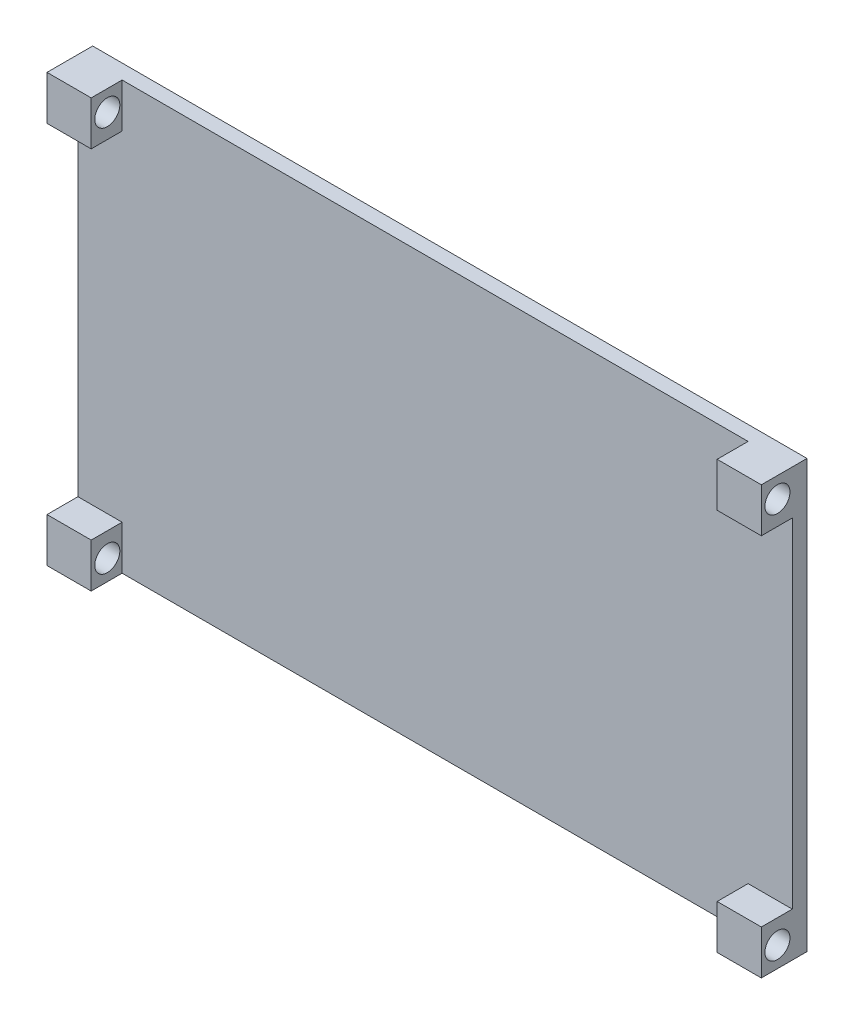
ISO-10303-21;
HEADER;
FILE_DESCRIPTION(('STEP AP214'),'2;1');
FILE_NAME('part.step','',(''),(''),'','','');
FILE_SCHEMA(('AUTOMOTIVE_DESIGN { 1 0 10303 214 1 1 1 1 }'));
ENDSEC;
DATA;
#1=APPLICATION_CONTEXT('core data for automotive mechanical design processes');
#2=APPLICATION_PROTOCOL_DEFINITION('international standard','automotive_design',2000,#1);
#3=PRODUCT_CONTEXT('',#1,'mechanical');
#4=PRODUCT('Part','Part','',(#3));
#5=PRODUCT_RELATED_PRODUCT_CATEGORY('part','',(#4));
#6=PRODUCT_DEFINITION_FORMATION('','',#4);
#7=PRODUCT_DEFINITION_CONTEXT('part definition',#1,'design');
#8=PRODUCT_DEFINITION('design','',#6,#7);
#9=PRODUCT_DEFINITION_SHAPE('','',#8);
#10=(LENGTH_UNIT() NAMED_UNIT(*) SI_UNIT(.MILLI.,.METRE.));
#11=(NAMED_UNIT(*) PLANE_ANGLE_UNIT() SI_UNIT($,.RADIAN.));
#12=(NAMED_UNIT(*) SI_UNIT($,.STERADIAN.) SOLID_ANGLE_UNIT());
#13=UNCERTAINTY_MEASURE_WITH_UNIT(LENGTH_MEASURE(1.E-05),#10,'distance_accuracy_value','');
#14=(GEOMETRIC_REPRESENTATION_CONTEXT(3) GLOBAL_UNCERTAINTY_ASSIGNED_CONTEXT((#13)) GLOBAL_UNIT_ASSIGNED_CONTEXT((#10,
#11,#12)) REPRESENTATION_CONTEXT('',''));
#15=CARTESIAN_POINT('',(0.,0.,0.));
#16=DIRECTION('',(0.,0.,1.));
#17=DIRECTION('',(1.,0.,0.));
#18=AXIS2_PLACEMENT_3D('',#15,#16,#17);
#19=CARTESIAN_POINT('',(0.,0.,0.));
#20=DIRECTION('',(0.,0.,1.));
#21=DIRECTION('',(1.,0.,0.));
#22=AXIS2_PLACEMENT_3D('',#19,#20,#21);
#23=PLANE('',#22);
#24=DIRECTION('',(1.,0.,0.));
#25=VECTOR('',#24,1.);
#26=CARTESIAN_POINT('',(48.5,23.,0.));
#27=LINE('',#26,#25);
#28=CARTESIAN_POINT('',(42.5,23.,0.));
#29=VERTEX_POINT('',#28);
#30=CARTESIAN_POINT('',(48.5,23.,0.));
#31=VERTEX_POINT('',#30);
#32=EDGE_CURVE('E57',#29,#31,#27,.T.);
#33=ORIENTED_EDGE('',*,*,#32,.F.);
#34=DIRECTION('',(0.,-1.,0.));
#35=VECTOR('',#34,1.);
#36=CARTESIAN_POINT('',(42.5,29.,0.));
#37=LINE('',#36,#35);
#38=CARTESIAN_POINT('',(42.5,29.,0.));
#39=VERTEX_POINT('',#38);
#40=EDGE_CURVE('E184',#39,#29,#37,.T.);
#41=ORIENTED_EDGE('',*,*,#40,.F.);
#42=DIRECTION('',(-1.,0.,0.));
#43=VECTOR('',#42,1.);
#44=CARTESIAN_POINT('',(-48.5,29.,0.));
#45=LINE('',#44,#43);
#46=CARTESIAN_POINT('',(-42.5,29.,0.));
#47=VERTEX_POINT('',#46);
#48=EDGE_CURVE('E317',#39,#47,#45,.T.);
#49=ORIENTED_EDGE('',*,*,#48,.T.);
#50=DIRECTION('',(0.,1.,0.));
#51=VECTOR('',#50,1.);
#52=CARTESIAN_POINT('',(-42.5,29.,0.));
#53=LINE('',#52,#51);
#54=CARTESIAN_POINT('',(-42.5,23.,0.));
#55=VERTEX_POINT('',#54);
#56=EDGE_CURVE('E274',#55,#47,#53,.T.);
#57=ORIENTED_EDGE('',*,*,#56,.F.);
#58=DIRECTION('',(1.,0.,0.));
#59=VECTOR('',#58,1.);
#60=CARTESIAN_POINT('',(-48.5,23.,0.));
#61=LINE('',#60,#59);
#62=CARTESIAN_POINT('',(-48.5,23.,0.));
#63=VERTEX_POINT('',#62);
#64=EDGE_CURVE('E268',#63,#55,#61,.T.);
#65=ORIENTED_EDGE('',*,*,#64,.F.);
#66=DIRECTION('',(0.,-1.,0.));
#67=VECTOR('',#66,1.);
#68=CARTESIAN_POINT('',(-48.5,29.,0.));
#69=LINE('',#68,#67);
#70=CARTESIAN_POINT('',(-48.5,-23.,0.));
#71=VERTEX_POINT('',#70);
#72=EDGE_CURVE('E320',#63,#71,#69,.T.);
#73=ORIENTED_EDGE('',*,*,#72,.T.);
#74=DIRECTION('',(-1.,0.,0.));
#75=VECTOR('',#74,1.);
#76=CARTESIAN_POINT('',(-48.5,-23.,0.));
#77=LINE('',#76,#75);
#78=CARTESIAN_POINT('',(-42.5,-23.,0.));
#79=VERTEX_POINT('',#78);
#80=EDGE_CURVE('E244',#79,#71,#77,.T.);
#81=ORIENTED_EDGE('',*,*,#80,.F.);
#82=DIRECTION('',(0.,1.,0.));
#83=VECTOR('',#82,1.);
#84=CARTESIAN_POINT('',(-42.5,-29.,0.));
#85=LINE('',#84,#83);
#86=CARTESIAN_POINT('',(-42.5,-29.,0.));
#87=VERTEX_POINT('',#86);
#88=EDGE_CURVE('E238',#87,#79,#85,.T.);
#89=ORIENTED_EDGE('',*,*,#88,.F.);
#90=DIRECTION('',(1.,0.,0.));
#91=VECTOR('',#90,1.);
#92=CARTESIAN_POINT('',(-48.5,-29.,0.));
#93=LINE('',#92,#91);
#94=CARTESIAN_POINT('',(42.4999999999999,-29.,0.));
#95=VERTEX_POINT('',#94);
#96=EDGE_CURVE('E305',#87,#95,#93,.T.);
#97=ORIENTED_EDGE('',*,*,#96,.T.);
#98=DIRECTION('',(0.,-1.,0.));
#99=VECTOR('',#98,1.);
#100=CARTESIAN_POINT('',(42.5,-29.,0.));
#101=LINE('',#100,#99);
#102=CARTESIAN_POINT('',(42.5,-23.,0.));
#103=VERTEX_POINT('',#102);
#104=EDGE_CURVE('E211',#103,#95,#101,.T.);
#105=ORIENTED_EDGE('',*,*,#104,.F.);
#106=DIRECTION('',(-1.,0.,0.));
#107=VECTOR('',#106,1.);
#108=CARTESIAN_POINT('',(48.5,-23.,0.));
#109=LINE('',#108,#107);
#110=CARTESIAN_POINT('',(48.5,-23.,0.));
#111=VERTEX_POINT('',#110);
#112=EDGE_CURVE('E205',#111,#103,#109,.T.);
#113=ORIENTED_EDGE('',*,*,#112,.F.);
#114=DIRECTION('',(0.,1.,0.));
#115=VECTOR('',#114,1.);
#116=CARTESIAN_POINT('',(48.5,29.,0.));
#117=LINE('',#116,#115);
#118=EDGE_CURVE('E62',#111,#31,#117,.T.);
#119=ORIENTED_EDGE('',*,*,#118,.T.);
#120=EDGE_LOOP('',(#33,#41,#49,#57,#65,#73,#81,#89,#97,#105,#113,#119));
#121=FACE_BOUND('',#120,.T.);
#122=ADVANCED_FACE('F39',(#121),#23,.T.);
#123=CARTESIAN_POINT('',(48.5,29.,-2.));
#124=DIRECTION('',(1.,0.,0.));
#125=DIRECTION('',(0.,1.,0.));
#126=AXIS2_PLACEMENT_3D('',#123,#124,#125);
#127=PLANE('',#126);
#128=CARTESIAN_POINT('',(48.5,26.225,2.01153592672852));
#129=DIRECTION('',(-1.,0.,0.));
#130=DIRECTION('',(0.,-1.,0.));
#131=AXIS2_PLACEMENT_3D('',#128,#129,#130);
#132=CIRCLE('',#131,1.7);
#133=CARTESIAN_POINT('',(48.5,24.525,2.01153592672852));
#134=VERTEX_POINT('',#133);
#135=EDGE_CURVE('E333',#134,#134,#132,.T.);
#136=ORIENTED_EDGE('',*,*,#135,.T.);
#137=EDGE_LOOP('',(#136));
#138=FACE_BOUND('',#137,.T.);
#139=CARTESIAN_POINT('',(48.5,-26.225,2.01153592672852));
#140=DIRECTION('',(-1.,0.,0.));
#141=DIRECTION('',(0.,1.,0.));
#142=AXIS2_PLACEMENT_3D('',#139,#140,#141);
#143=CIRCLE('',#142,1.7);
#144=CARTESIAN_POINT('',(48.5,-27.925,2.01153592672852));
#145=VERTEX_POINT('',#144);
#146=EDGE_CURVE('E346',#145,#145,#143,.T.);
#147=ORIENTED_EDGE('',*,*,#146,.T.);
#148=EDGE_LOOP('',(#147));
#149=FACE_BOUND('',#148,.T.);
#150=ORIENTED_EDGE('',*,*,#118,.F.);
#151=DIRECTION('',(0.,0.,-1.));
#152=VECTOR('',#151,1.);
#153=CARTESIAN_POINT('',(48.5,-23.,4.2));
#154=LINE('',#153,#152);
#155=CARTESIAN_POINT('',(48.5,-23.,4.2));
#156=VERTEX_POINT('',#155);
#157=EDGE_CURVE('E234',#156,#111,#154,.T.);
#158=ORIENTED_EDGE('',*,*,#157,.F.);
#159=DIRECTION('',(0.,1.,0.));
#160=VECTOR('',#159,1.);
#161=CARTESIAN_POINT('',(48.5,-29.,4.2));
#162=LINE('',#161,#160);
#163=CARTESIAN_POINT('',(48.5,-29.,4.2));
#164=VERTEX_POINT('',#163);
#165=EDGE_CURVE('E210',#164,#156,#162,.T.);
#166=ORIENTED_EDGE('',*,*,#165,.F.);
#167=DIRECTION('',(0.,0.,1.));
#168=VECTOR('',#167,1.);
#169=CARTESIAN_POINT('',(48.5,-29.,-2.));
#170=LINE('',#169,#168);
#171=CARTESIAN_POINT('',(48.5,-29.,-2.));
#172=VERTEX_POINT('',#171);
#173=EDGE_CURVE('E11',#172,#164,#170,.T.);
#174=ORIENTED_EDGE('',*,*,#173,.F.);
#175=DIRECTION('',(0.,1.,0.));
#176=VECTOR('',#175,1.);
#177=CARTESIAN_POINT('',(48.5,29.,-2.));
#178=LINE('',#177,#176);
#179=CARTESIAN_POINT('',(48.5,29.,-2.));
#180=VERTEX_POINT('',#179);
#181=EDGE_CURVE('E159',#172,#180,#178,.T.);
#182=ORIENTED_EDGE('',*,*,#181,.T.);
#183=DIRECTION('',(0.,0.,1.));
#184=VECTOR('',#183,1.);
#185=CARTESIAN_POINT('',(48.5,29.,-2.));
#186=LINE('',#185,#184);
#187=CARTESIAN_POINT('',(48.5,29.,4.2));
#188=VERTEX_POINT('',#187);
#189=EDGE_CURVE('E153',#180,#188,#186,.T.);
#190=ORIENTED_EDGE('',*,*,#189,.T.);
#191=DIRECTION('',(0.,1.,0.));
#192=VECTOR('',#191,1.);
#193=CARTESIAN_POINT('',(48.5,29.,4.2));
#194=LINE('',#193,#192);
#195=CARTESIAN_POINT('',(48.5,23.,4.2));
#196=VERTEX_POINT('',#195);
#197=EDGE_CURVE('E157',#196,#188,#194,.T.);
#198=ORIENTED_EDGE('',*,*,#197,.F.);
#199=DIRECTION('',(0.,0.,-1.));
#200=VECTOR('',#199,1.);
#201=CARTESIAN_POINT('',(48.5,23.,4.2));
#202=LINE('',#201,#200);
#203=EDGE_CURVE('E194',#196,#31,#202,.T.);
#204=ORIENTED_EDGE('',*,*,#203,.T.);
#205=EDGE_LOOP('',(#150,#158,#166,#174,#182,#190,#198,#204));
#206=FACE_BOUND('',#205,.T.);
#207=ADVANCED_FACE('F41',(#138,#149,#206),#127,.T.);
#208=CARTESIAN_POINT('',(-48.5,-29.,-2.));
#209=DIRECTION('',(0.,-1.,0.));
#210=DIRECTION('',(0.,0.,-1.));
#211=AXIS2_PLACEMENT_3D('',#208,#209,#210);
#212=PLANE('',#211);
#213=ORIENTED_EDGE('',*,*,#96,.F.);
#214=DIRECTION('',(0.,0.,-1.));
#215=VECTOR('',#214,1.);
#216=CARTESIAN_POINT('',(-42.5,-29.,4.2));
#217=LINE('',#216,#215);
#218=CARTESIAN_POINT('',(-42.5,-29.,4.2));
#219=VERTEX_POINT('',#218);
#220=EDGE_CURVE('E265',#219,#87,#217,.T.);
#221=ORIENTED_EDGE('',*,*,#220,.F.);
#222=DIRECTION('',(1.,0.,0.));
#223=VECTOR('',#222,1.);
#224=CARTESIAN_POINT('',(-48.5,-29.,4.2));
#225=LINE('',#224,#223);
#226=CARTESIAN_POINT('',(-48.5,-29.,4.2));
#227=VERTEX_POINT('',#226);
#228=EDGE_CURVE('E243',#227,#219,#225,.T.);
#229=ORIENTED_EDGE('',*,*,#228,.F.);
#230=DIRECTION('',(0.,0.,1.));
#231=VECTOR('',#230,1.);
#232=CARTESIAN_POINT('',(-48.5,-29.,-2.));
#233=LINE('',#232,#231);
#234=CARTESIAN_POINT('',(-48.5,-29.,-2.));
#235=VERTEX_POINT('',#234);
#236=EDGE_CURVE('E49',#235,#227,#233,.T.);
#237=ORIENTED_EDGE('',*,*,#236,.F.);
#238=DIRECTION('',(1.,0.,0.));
#239=VECTOR('',#238,1.);
#240=CARTESIAN_POINT('',(-48.5,-29.,-2.));
#241=LINE('',#240,#239);
#242=EDGE_CURVE('E165',#235,#172,#241,.T.);
#243=ORIENTED_EDGE('',*,*,#242,.T.);
#244=ORIENTED_EDGE('',*,*,#173,.T.);
#245=DIRECTION('',(1.,0.,0.));
#246=VECTOR('',#245,1.);
#247=CARTESIAN_POINT('',(48.5,-29.,4.2));
#248=LINE('',#247,#246);
#249=CARTESIAN_POINT('',(42.5,-29.,4.2));
#250=VERTEX_POINT('',#249);
#251=EDGE_CURVE('E206',#250,#164,#248,.T.);
#252=ORIENTED_EDGE('',*,*,#251,.F.);
#253=DIRECTION('',(0.,0.,-1.));
#254=VECTOR('',#253,1.);
#255=CARTESIAN_POINT('',(42.5,-29.,4.2));
#256=LINE('',#255,#254);
#257=EDGE_CURVE('E220',#250,#95,#256,.T.);
#258=ORIENTED_EDGE('',*,*,#257,.T.);
#259=EDGE_LOOP('',(#213,#221,#229,#237,#243,#244,#252,#258));
#260=FACE_BOUND('',#259,.T.);
#261=ADVANCED_FACE('F363',(#260),#212,.T.);
#262=CARTESIAN_POINT('',(-48.5,29.,-2.));
#263=DIRECTION('',(-1.,0.,0.));
#264=DIRECTION('',(0.,-1.,0.));
#265=AXIS2_PLACEMENT_3D('',#262,#263,#264);
#266=PLANE('',#265);
#267=CARTESIAN_POINT('',(-48.5,26.225,2.01153592672852));
#268=DIRECTION('',(-1.,0.,0.));
#269=DIRECTION('',(0.,-1.,0.));
#270=AXIS2_PLACEMENT_3D('',#267,#268,#269);
#271=CIRCLE('',#270,1.7);
#272=CARTESIAN_POINT('',(-48.5,24.525,2.01153592672852));
#273=VERTEX_POINT('',#272);
#274=EDGE_CURVE('E340',#273,#273,#271,.T.);
#275=ORIENTED_EDGE('',*,*,#274,.F.);
#276=EDGE_LOOP('',(#275));
#277=FACE_BOUND('',#276,.T.);
#278=CARTESIAN_POINT('',(-48.5,-26.225,2.01153592672852));
#279=DIRECTION('',(-1.,0.,0.));
#280=DIRECTION('',(0.,1.,0.));
#281=AXIS2_PLACEMENT_3D('',#278,#279,#280);
#282=CIRCLE('',#281,1.7);
#283=CARTESIAN_POINT('',(-48.5,-27.925,2.01153592672852));
#284=VERTEX_POINT('',#283);
#285=EDGE_CURVE('E352',#284,#284,#282,.T.);
#286=ORIENTED_EDGE('',*,*,#285,.F.);
#287=EDGE_LOOP('',(#286));
#288=FACE_BOUND('',#287,.T.);
#289=ORIENTED_EDGE('',*,*,#72,.F.);
#290=DIRECTION('',(0.,0.,-1.));
#291=VECTOR('',#290,1.);
#292=CARTESIAN_POINT('',(-48.5,23.,4.2));
#293=LINE('',#292,#291);
#294=CARTESIAN_POINT('',(-48.5,23.,4.2));
#295=VERTEX_POINT('',#294);
#296=EDGE_CURVE('E298',#295,#63,#293,.T.);
#297=ORIENTED_EDGE('',*,*,#296,.F.);
#298=DIRECTION('',(0.,-1.,0.));
#299=VECTOR('',#298,1.);
#300=CARTESIAN_POINT('',(-48.5,29.,4.2));
#301=LINE('',#300,#299);
#302=CARTESIAN_POINT('',(-48.5,29.,4.2));
#303=VERTEX_POINT('',#302);
#304=EDGE_CURVE('E269',#303,#295,#301,.T.);
#305=ORIENTED_EDGE('',*,*,#304,.F.);
#306=DIRECTION('',(0.,0.,1.));
#307=VECTOR('',#306,1.);
#308=CARTESIAN_POINT('',(-48.5,29.,-2.));
#309=LINE('',#308,#307);
#310=CARTESIAN_POINT('',(-48.5,29.,-2.));
#311=VERTEX_POINT('',#310);
#312=EDGE_CURVE('E164',#311,#303,#309,.T.);
#313=ORIENTED_EDGE('',*,*,#312,.F.);
#314=DIRECTION('',(0.,-1.,0.));
#315=VECTOR('',#314,1.);
#316=CARTESIAN_POINT('',(-48.5,29.,-2.));
#317=LINE('',#316,#315);
#318=EDGE_CURVE('E308',#311,#235,#317,.T.);
#319=ORIENTED_EDGE('',*,*,#318,.T.);
#320=ORIENTED_EDGE('',*,*,#236,.T.);
#321=DIRECTION('',(0.,-1.,0.));
#322=VECTOR('',#321,1.);
#323=CARTESIAN_POINT('',(-48.5,-29.,4.2));
#324=LINE('',#323,#322);
#325=CARTESIAN_POINT('',(-48.5,-23.,4.2));
#326=VERTEX_POINT('',#325);
#327=EDGE_CURVE('E239',#326,#227,#324,.T.);
#328=ORIENTED_EDGE('',*,*,#327,.F.);
#329=DIRECTION('',(0.,0.,-1.));
#330=VECTOR('',#329,1.);
#331=CARTESIAN_POINT('',(-48.5,-23.,4.2));
#332=LINE('',#331,#330);
#333=EDGE_CURVE('E253',#326,#71,#332,.T.);
#334=ORIENTED_EDGE('',*,*,#333,.T.);
#335=EDGE_LOOP('',(#289,#297,#305,#313,#319,#320,#328,#334));
#336=FACE_BOUND('',#335,.T.);
#337=ADVANCED_FACE('F360',(#277,#288,#336),#266,.T.);
#338=CARTESIAN_POINT('',(-48.5,29.,-2.));
#339=DIRECTION('',(0.,1.,0.));
#340=DIRECTION('',(0.,0.,1.));
#341=AXIS2_PLACEMENT_3D('',#338,#339,#340);
#342=PLANE('',#341);
#343=ORIENTED_EDGE('',*,*,#48,.F.);
#344=DIRECTION('',(0.,0.,-1.));
#345=VECTOR('',#344,1.);
#346=CARTESIAN_POINT('',(42.5,29.,4.2));
#347=LINE('',#346,#345);
#348=CARTESIAN_POINT('',(42.5,29.,4.2));
#349=VERTEX_POINT('',#348);
#350=EDGE_CURVE('E171',#349,#39,#347,.T.);
#351=ORIENTED_EDGE('',*,*,#350,.F.);
#352=DIRECTION('',(-1.,0.,0.));
#353=VECTOR('',#352,1.);
#354=CARTESIAN_POINT('',(48.5,29.,4.2));
#355=LINE('',#354,#353);
#356=EDGE_CURVE('E168',#188,#349,#355,.T.);
#357=ORIENTED_EDGE('',*,*,#356,.F.);
#358=ORIENTED_EDGE('',*,*,#189,.F.);
#359=DIRECTION('',(-1.,0.,0.));
#360=VECTOR('',#359,1.);
#361=CARTESIAN_POINT('',(-48.5,29.,-2.));
#362=LINE('',#361,#360);
#363=EDGE_CURVE('E304',#180,#311,#362,.T.);
#364=ORIENTED_EDGE('',*,*,#363,.T.);
#365=ORIENTED_EDGE('',*,*,#312,.T.);
#366=DIRECTION('',(-1.,0.,0.));
#367=VECTOR('',#366,1.);
#368=CARTESIAN_POINT('',(-48.5,29.,4.2));
#369=LINE('',#368,#367);
#370=CARTESIAN_POINT('',(-42.5,29.,4.2));
#371=VERTEX_POINT('',#370);
#372=EDGE_CURVE('E280',#371,#303,#369,.T.);
#373=ORIENTED_EDGE('',*,*,#372,.F.);
#374=DIRECTION('',(0.,0.,-1.));
#375=VECTOR('',#374,1.);
#376=CARTESIAN_POINT('',(-42.5,29.,4.2));
#377=LINE('',#376,#375);
#378=EDGE_CURVE('E284',#371,#47,#377,.T.);
#379=ORIENTED_EDGE('',*,*,#378,.T.);
#380=EDGE_LOOP('',(#343,#351,#357,#358,#364,#365,#373,#379));
#381=FACE_BOUND('',#380,.T.);
#382=ADVANCED_FACE('F169',(#381),#342,.T.);
#383=CARTESIAN_POINT('',(0.,0.,-2.));
#384=DIRECTION('',(0.,0.,1.));
#385=DIRECTION('',(1.,0.,0.));
#386=AXIS2_PLACEMENT_3D('',#383,#384,#385);
#387=PLANE('',#386);
#388=ORIENTED_EDGE('',*,*,#181,.F.);
#389=ORIENTED_EDGE('',*,*,#242,.F.);
#390=ORIENTED_EDGE('',*,*,#318,.F.);
#391=ORIENTED_EDGE('',*,*,#363,.F.);
#392=EDGE_LOOP('',(#388,#389,#390,#391));
#393=FACE_BOUND('',#392,.T.);
#394=ADVANCED_FACE('F382',(#393),#387,.F.);
#395=CARTESIAN_POINT('',(-48.5,23.,4.2));
#396=DIRECTION('',(0.,1.,0.));
#397=DIRECTION('',(0.,0.,1.));
#398=AXIS2_PLACEMENT_3D('',#395,#396,#397);
#399=PLANE('',#398);
#400=ORIENTED_EDGE('',*,*,#64,.T.);
#401=DIRECTION('',(0.,0.,-1.));
#402=VECTOR('',#401,1.);
#403=CARTESIAN_POINT('',(-42.5,23.,4.2));
#404=LINE('',#403,#402);
#405=CARTESIAN_POINT('',(-42.5,23.,4.2));
#406=VERTEX_POINT('',#405);
#407=EDGE_CURVE('E294',#406,#55,#404,.T.);
#408=ORIENTED_EDGE('',*,*,#407,.F.);
#409=DIRECTION('',(1.,0.,0.));
#410=VECTOR('',#409,1.);
#411=CARTESIAN_POINT('',(-48.5,23.,4.2));
#412=LINE('',#411,#410);
#413=EDGE_CURVE('E273',#295,#406,#412,.T.);
#414=ORIENTED_EDGE('',*,*,#413,.F.);
#415=ORIENTED_EDGE('',*,*,#296,.T.);
#416=EDGE_LOOP('',(#400,#408,#414,#415));
#417=FACE_BOUND('',#416,.T.);
#418=ADVANCED_FACE('F373',(#417),#399,.F.);
#419=CARTESIAN_POINT('',(-42.5,29.,4.2));
#420=DIRECTION('',(-1.,0.,0.));
#421=DIRECTION('',(0.,-1.,0.));
#422=AXIS2_PLACEMENT_3D('',#419,#420,#421);
#423=PLANE('',#422);
#424=CARTESIAN_POINT('',(-42.5,26.225,2.01153592672852));
#425=DIRECTION('',(-1.,0.,0.));
#426=DIRECTION('',(0.,-1.,0.));
#427=AXIS2_PLACEMENT_3D('',#424,#425,#426);
#428=CIRCLE('',#427,1.7);
#429=CARTESIAN_POINT('',(-42.5,24.525,2.01153592672852));
#430=VERTEX_POINT('',#429);
#431=EDGE_CURVE('E332',#430,#430,#428,.T.);
#432=ORIENTED_EDGE('',*,*,#431,.T.);
#433=EDGE_LOOP('',(#432));
#434=FACE_BOUND('',#433,.T.);
#435=ORIENTED_EDGE('',*,*,#56,.T.);
#436=ORIENTED_EDGE('',*,*,#378,.F.);
#437=DIRECTION('',(0.,1.,0.));
#438=VECTOR('',#437,1.);
#439=CARTESIAN_POINT('',(-42.5,29.,4.2));
#440=LINE('',#439,#438);
#441=EDGE_CURVE('E277',#406,#371,#440,.T.);
#442=ORIENTED_EDGE('',*,*,#441,.F.);
#443=ORIENTED_EDGE('',*,*,#407,.T.);
#444=EDGE_LOOP('',(#435,#436,#442,#443));
#445=FACE_BOUND('',#444,.T.);
#446=ADVANCED_FACE('F414',(#434,#445),#423,.F.);
#447=CARTESIAN_POINT('',(0.,0.,4.2));
#448=DIRECTION('',(0.,0.,1.));
#449=DIRECTION('',(1.,0.,0.));
#450=AXIS2_PLACEMENT_3D('',#447,#448,#449);
#451=PLANE('',#450);
#452=ORIENTED_EDGE('',*,*,#304,.T.);
#453=ORIENTED_EDGE('',*,*,#413,.T.);
#454=ORIENTED_EDGE('',*,*,#441,.T.);
#455=ORIENTED_EDGE('',*,*,#372,.T.);
#456=EDGE_LOOP('',(#452,#453,#454,#455));
#457=FACE_BOUND('',#456,.T.);
#458=ADVANCED_FACE('F377',(#457),#451,.T.);
#459=CARTESIAN_POINT('',(-42.5,-29.,4.2));
#460=DIRECTION('',(-1.,0.,0.));
#461=DIRECTION('',(0.,-1.,0.));
#462=AXIS2_PLACEMENT_3D('',#459,#460,#461);
#463=PLANE('',#462);
#464=CARTESIAN_POINT('',(-42.5,-26.225,2.01153592672852));
#465=DIRECTION('',(-1.,0.,0.));
#466=DIRECTION('',(0.,-1.,0.));
#467=AXIS2_PLACEMENT_3D('',#464,#465,#466);
#468=CIRCLE('',#467,1.7);
#469=CARTESIAN_POINT('',(-42.5,-27.925,2.01153592672852));
#470=VERTEX_POINT('',#469);
#471=EDGE_CURVE('E187',#470,#470,#468,.T.);
#472=ORIENTED_EDGE('',*,*,#471,.T.);
#473=EDGE_LOOP('',(#472));
#474=FACE_BOUND('',#473,.T.);
#475=ORIENTED_EDGE('',*,*,#88,.T.);
#476=DIRECTION('',(0.,0.,-1.));
#477=VECTOR('',#476,1.);
#478=CARTESIAN_POINT('',(-42.5,-23.,4.2));
#479=LINE('',#478,#477);
#480=CARTESIAN_POINT('',(-42.5,-23.,4.2));
#481=VERTEX_POINT('',#480);
#482=EDGE_CURVE('E262',#481,#79,#479,.T.);
#483=ORIENTED_EDGE('',*,*,#482,.F.);
#484=DIRECTION('',(0.,1.,0.));
#485=VECTOR('',#484,1.);
#486=CARTESIAN_POINT('',(-42.5,-29.,4.2));
#487=LINE('',#486,#485);
#488=EDGE_CURVE('E247',#219,#481,#487,.T.);
#489=ORIENTED_EDGE('',*,*,#488,.F.);
#490=ORIENTED_EDGE('',*,*,#220,.T.);
#491=EDGE_LOOP('',(#475,#483,#489,#490));
#492=FACE_BOUND('',#491,.T.);
#493=ADVANCED_FACE('F422',(#474,#492),#463,.F.);
#494=CARTESIAN_POINT('',(-48.5,-23.,4.2));
#495=DIRECTION('',(0.,-1.,0.));
#496=DIRECTION('',(0.,0.,-1.));
#497=AXIS2_PLACEMENT_3D('',#494,#495,#496);
#498=PLANE('',#497);
#499=ORIENTED_EDGE('',*,*,#80,.T.);
#500=ORIENTED_EDGE('',*,*,#333,.F.);
#501=DIRECTION('',(-1.,0.,0.));
#502=VECTOR('',#501,1.);
#503=CARTESIAN_POINT('',(-48.5,-23.,4.2));
#504=LINE('',#503,#502);
#505=EDGE_CURVE('E250',#481,#326,#504,.T.);
#506=ORIENTED_EDGE('',*,*,#505,.F.);
#507=ORIENTED_EDGE('',*,*,#482,.T.);
#508=EDGE_LOOP('',(#499,#500,#506,#507));
#509=FACE_BOUND('',#508,.T.);
#510=ADVANCED_FACE('F395',(#509),#498,.F.);
#511=CARTESIAN_POINT('',(0.,0.,4.2));
#512=DIRECTION('',(0.,0.,-1.));
#513=DIRECTION('',(-1.,0.,0.));
#514=AXIS2_PLACEMENT_3D('',#511,#512,#513);
#515=PLANE('',#514);
#516=ORIENTED_EDGE('',*,*,#327,.T.);
#517=ORIENTED_EDGE('',*,*,#228,.T.);
#518=ORIENTED_EDGE('',*,*,#488,.T.);
#519=ORIENTED_EDGE('',*,*,#505,.T.);
#520=EDGE_LOOP('',(#516,#517,#518,#519));
#521=FACE_BOUND('',#520,.T.);
#522=ADVANCED_FACE('F390',(#521),#515,.F.);
#523=CARTESIAN_POINT('',(48.5,-23.,4.2));
#524=DIRECTION('',(0.,-1.,0.));
#525=DIRECTION('',(0.,0.,-1.));
#526=AXIS2_PLACEMENT_3D('',#523,#524,#525);
#527=PLANE('',#526);
#528=ORIENTED_EDGE('',*,*,#112,.T.);
#529=DIRECTION('',(0.,0.,-1.));
#530=VECTOR('',#529,1.);
#531=CARTESIAN_POINT('',(42.5,-23.,4.2));
#532=LINE('',#531,#530);
#533=CARTESIAN_POINT('',(42.5,-23.,4.2));
#534=VERTEX_POINT('',#533);
#535=EDGE_CURVE('E230',#534,#103,#532,.T.);
#536=ORIENTED_EDGE('',*,*,#535,.F.);
#537=DIRECTION('',(-1.,0.,0.));
#538=VECTOR('',#537,1.);
#539=CARTESIAN_POINT('',(48.5,-23.,4.2));
#540=LINE('',#539,#538);
#541=EDGE_CURVE('E214',#156,#534,#540,.T.);
#542=ORIENTED_EDGE('',*,*,#541,.F.);
#543=ORIENTED_EDGE('',*,*,#157,.T.);
#544=EDGE_LOOP('',(#528,#536,#542,#543));
#545=FACE_BOUND('',#544,.T.);
#546=ADVANCED_FACE('F404',(#545),#527,.F.);
#547=CARTESIAN_POINT('',(42.5,-29.,4.2));
#548=DIRECTION('',(1.,0.,0.));
#549=DIRECTION('',(0.,1.,0.));
#550=AXIS2_PLACEMENT_3D('',#547,#548,#549);
#551=PLANE('',#550);
#552=CARTESIAN_POINT('',(42.5,-26.225,2.01153592672852));
#553=DIRECTION('',(1.,0.,0.));
#554=DIRECTION('',(0.,1.,0.));
#555=AXIS2_PLACEMENT_3D('',#552,#553,#554);
#556=CIRCLE('',#555,1.7);
#557=CARTESIAN_POINT('',(42.5,-27.925,2.01153592672852));
#558=VERTEX_POINT('',#557);
#559=EDGE_CURVE('E43',#558,#558,#556,.T.);
#560=ORIENTED_EDGE('',*,*,#559,.T.);
#561=EDGE_LOOP('',(#560));
#562=FACE_BOUND('',#561,.T.);
#563=ORIENTED_EDGE('',*,*,#104,.T.);
#564=ORIENTED_EDGE('',*,*,#257,.F.);
#565=DIRECTION('',(0.,-1.,0.));
#566=VECTOR('',#565,1.);
#567=CARTESIAN_POINT('',(42.5,-29.,4.2));
#568=LINE('',#567,#566);
#569=EDGE_CURVE('E217',#534,#250,#568,.T.);
#570=ORIENTED_EDGE('',*,*,#569,.F.);
#571=ORIENTED_EDGE('',*,*,#535,.T.);
#572=EDGE_LOOP('',(#563,#564,#570,#571));
#573=FACE_BOUND('',#572,.T.);
#574=ADVANCED_FACE('F401',(#562,#573),#551,.F.);
#575=CARTESIAN_POINT('',(0.,0.,4.2));
#576=DIRECTION('',(0.,0.,-1.));
#577=DIRECTION('',(-1.,0.,0.));
#578=AXIS2_PLACEMENT_3D('',#575,#576,#577);
#579=PLANE('',#578);
#580=ORIENTED_EDGE('',*,*,#251,.T.);
#581=ORIENTED_EDGE('',*,*,#165,.T.);
#582=ORIENTED_EDGE('',*,*,#541,.T.);
#583=ORIENTED_EDGE('',*,*,#569,.T.);
#584=EDGE_LOOP('',(#580,#581,#582,#583));
#585=FACE_BOUND('',#584,.T.);
#586=ADVANCED_FACE('F486',(#585),#579,.F.);
#587=CARTESIAN_POINT('',(42.5,29.,4.2));
#588=DIRECTION('',(1.,0.,0.));
#589=DIRECTION('',(0.,1.,0.));
#590=AXIS2_PLACEMENT_3D('',#587,#588,#589);
#591=PLANE('',#590);
#592=CARTESIAN_POINT('',(42.5,26.225,2.01153592672852));
#593=DIRECTION('',(1.,0.,0.));
#594=DIRECTION('',(0.,1.,0.));
#595=AXIS2_PLACEMENT_3D('',#592,#593,#594);
#596=CIRCLE('',#595,1.7);
#597=CARTESIAN_POINT('',(42.5,24.525,2.01153592672852));
#598=VERTEX_POINT('',#597);
#599=EDGE_CURVE('E329',#598,#598,#596,.T.);
#600=ORIENTED_EDGE('',*,*,#599,.T.);
#601=EDGE_LOOP('',(#600));
#602=FACE_BOUND('',#601,.T.);
#603=ORIENTED_EDGE('',*,*,#40,.T.);
#604=DIRECTION('',(0.,0.,-1.));
#605=VECTOR('',#604,1.);
#606=CARTESIAN_POINT('',(42.5,23.,4.2));
#607=LINE('',#606,#605);
#608=CARTESIAN_POINT('',(42.5,23.,4.2));
#609=VERTEX_POINT('',#608);
#610=EDGE_CURVE('E199',#609,#29,#607,.T.);
#611=ORIENTED_EDGE('',*,*,#610,.F.);
#612=DIRECTION('',(0.,-1.,0.));
#613=VECTOR('',#612,1.);
#614=CARTESIAN_POINT('',(42.5,29.,4.2));
#615=LINE('',#614,#613);
#616=EDGE_CURVE('E175',#349,#609,#615,.T.);
#617=ORIENTED_EDGE('',*,*,#616,.F.);
#618=ORIENTED_EDGE('',*,*,#350,.T.);
#619=EDGE_LOOP('',(#603,#611,#617,#618));
#620=FACE_BOUND('',#619,.T.);
#621=ADVANCED_FACE('F411',(#602,#620),#591,.F.);
#622=CARTESIAN_POINT('',(48.5,23.,4.2));
#623=DIRECTION('',(0.,1.,0.));
#624=DIRECTION('',(0.,0.,1.));
#625=AXIS2_PLACEMENT_3D('',#622,#623,#624);
#626=PLANE('',#625);
#627=ORIENTED_EDGE('',*,*,#32,.T.);
#628=ORIENTED_EDGE('',*,*,#203,.F.);
#629=DIRECTION('',(1.,0.,0.));
#630=VECTOR('',#629,1.);
#631=CARTESIAN_POINT('',(48.5,23.,4.2));
#632=LINE('',#631,#630);
#633=EDGE_CURVE('E179',#609,#196,#632,.T.);
#634=ORIENTED_EDGE('',*,*,#633,.F.);
#635=ORIENTED_EDGE('',*,*,#610,.T.);
#636=EDGE_LOOP('',(#627,#628,#634,#635));
#637=FACE_BOUND('',#636,.T.);
#638=ADVANCED_FACE('F408',(#637),#626,.F.);
#639=CARTESIAN_POINT('',(0.,0.,4.2));
#640=DIRECTION('',(0.,0.,-1.));
#641=DIRECTION('',(-1.,0.,0.));
#642=AXIS2_PLACEMENT_3D('',#639,#640,#641);
#643=PLANE('',#642);
#644=ORIENTED_EDGE('',*,*,#197,.T.);
#645=ORIENTED_EDGE('',*,*,#356,.T.);
#646=ORIENTED_EDGE('',*,*,#616,.T.);
#647=ORIENTED_EDGE('',*,*,#633,.T.);
#648=EDGE_LOOP('',(#644,#645,#646,#647));
#649=FACE_BOUND('',#648,.T.);
#650=ADVANCED_FACE('F177',(#649),#643,.F.);
#651=CARTESIAN_POINT('',(48.5,26.225,2.01153592672852));
#652=DIRECTION('',(-1.,0.,0.));
#653=DIRECTION('',(0.,-1.,0.));
#654=AXIS2_PLACEMENT_3D('',#651,#652,#653);
#655=CYLINDRICAL_SURFACE('',#654,1.7);
#656=CARTESIAN_POINT('',(48.5,24.525,2.01153592672852));
#657=CARTESIAN_POINT('',(48.4375,24.525,2.01153592672852));
#658=CARTESIAN_POINT('',(48.375,24.525,2.01153592672852));
#659=CARTESIAN_POINT('',(48.25,24.525,2.01153592672852));
#660=CARTESIAN_POINT('',(48.1875,24.525,2.01153592672852));
#661=CARTESIAN_POINT('',(48.0625,24.525,2.01153592672852));
#662=CARTESIAN_POINT('',(48.,24.525,2.01153592672852));
#663=CARTESIAN_POINT('',(47.875,24.525,2.01153592672852));
#664=CARTESIAN_POINT('',(47.8125,24.525,2.01153592672852));
#665=CARTESIAN_POINT('',(47.6875,24.525,2.01153592672852));
#666=CARTESIAN_POINT('',(47.625,24.525,2.01153592672852));
#667=CARTESIAN_POINT('',(47.5,24.525,2.01153592672852));
#668=CARTESIAN_POINT('',(47.4375,24.525,2.01153592672852));
#669=CARTESIAN_POINT('',(47.3125,24.525,2.01153592672852));
#670=CARTESIAN_POINT('',(47.25,24.525,2.01153592672852));
#671=CARTESIAN_POINT('',(47.125,24.525,2.01153592672852));
#672=CARTESIAN_POINT('',(47.0625,24.525,2.01153592672852));
#673=CARTESIAN_POINT('',(46.9375,24.525,2.01153592672852));
#674=CARTESIAN_POINT('',(46.875,24.525,2.01153592672852));
#675=CARTESIAN_POINT('',(46.75,24.525,2.01153592672852));
#676=CARTESIAN_POINT('',(46.6875,24.525,2.01153592672852));
#677=CARTESIAN_POINT('',(46.5625,24.525,2.01153592672852));
#678=CARTESIAN_POINT('',(46.5,24.525,2.01153592672852));
#679=CARTESIAN_POINT('',(46.375,24.525,2.01153592672852));
#680=CARTESIAN_POINT('',(46.3125,24.525,2.01153592672852));
#681=CARTESIAN_POINT('',(46.1875,24.525,2.01153592672852));
#682=CARTESIAN_POINT('',(46.125,24.525,2.01153592672852));
#683=CARTESIAN_POINT('',(46.,24.525,2.01153592672852));
#684=CARTESIAN_POINT('',(45.9375,24.525,2.01153592672852));
#685=CARTESIAN_POINT('',(45.8125,24.525,2.01153592672852));
#686=CARTESIAN_POINT('',(45.75,24.525,2.01153592672852));
#687=CARTESIAN_POINT('',(45.625,24.525,2.01153592672852));
#688=CARTESIAN_POINT('',(45.5625,24.525,2.01153592672852));
#689=CARTESIAN_POINT('',(45.4375,24.525,2.01153592672852));
#690=CARTESIAN_POINT('',(45.375,24.525,2.01153592672852));
#691=CARTESIAN_POINT('',(45.25,24.525,2.01153592672852));
#692=CARTESIAN_POINT('',(45.1875,24.525,2.01153592672852));
#693=CARTESIAN_POINT('',(45.0625,24.525,2.01153592672852));
#694=CARTESIAN_POINT('',(45.,24.525,2.01153592672852));
#695=CARTESIAN_POINT('',(44.875,24.525,2.01153592672852));
#696=CARTESIAN_POINT('',(44.8125,24.525,2.01153592672852));
#697=CARTESIAN_POINT('',(44.6875,24.525,2.01153592672852));
#698=CARTESIAN_POINT('',(44.625,24.525,2.01153592672852));
#699=CARTESIAN_POINT('',(44.5,24.525,2.01153592672852));
#700=CARTESIAN_POINT('',(44.4375,24.525,2.01153592672852));
#701=CARTESIAN_POINT('',(44.3125,24.525,2.01153592672852));
#702=CARTESIAN_POINT('',(44.25,24.525,2.01153592672852));
#703=CARTESIAN_POINT('',(44.125,24.525,2.01153592672852));
#704=CARTESIAN_POINT('',(44.0625,24.525,2.01153592672852));
#705=CARTESIAN_POINT('',(43.9375,24.525,2.01153592672852));
#706=CARTESIAN_POINT('',(43.875,24.525,2.01153592672852));
#707=CARTESIAN_POINT('',(43.75,24.525,2.01153592672852));
#708=CARTESIAN_POINT('',(43.6875,24.525,2.01153592672852));
#709=CARTESIAN_POINT('',(43.5625,24.525,2.01153592672852));
#710=CARTESIAN_POINT('',(43.5,24.525,2.01153592672852));
#711=CARTESIAN_POINT('',(43.375,24.525,2.01153592672852));
#712=CARTESIAN_POINT('',(43.3125,24.525,2.01153592672852));
#713=CARTESIAN_POINT('',(43.1875,24.525,2.01153592672852));
#714=CARTESIAN_POINT('',(43.125,24.525,2.01153592672852));
#715=CARTESIAN_POINT('',(43.,24.525,2.01153592672852));
#716=CARTESIAN_POINT('',(42.9375,24.525,2.01153592672852));
#717=CARTESIAN_POINT('',(42.8125,24.525,2.01153592672852));
#718=CARTESIAN_POINT('',(42.75,24.525,2.01153592672852));
#719=CARTESIAN_POINT('',(42.625,24.525,2.01153592672852));
#720=CARTESIAN_POINT('',(42.5625,24.525,2.01153592672852));
#721=CARTESIAN_POINT('',(42.5,24.525,2.01153592672852));
#722=B_SPLINE_CURVE_WITH_KNOTS('',3,(#656,#657,#658,#659,#660,#661,#662,#663,#664,#665,#666,
#667,#668,#669,#670,#671,#672,#673,#674,#675,#676,#677,#678,#679,#680,#681,#682,#683,#684,#685,
#686,#687,#688,#689,#690,#691,#692,#693,#694,#695,#696,#697,#698,#699,#700,#701,#702,#703,#704,
#705,#706,#707,#708,#709,#710,#711,#712,#713,#714,#715,#716,#717,#718,#719,#720,#721),
.UNSPECIFIED.,.F.,.F.,(4,2,2,2,2,2,2,2,2,2,2,2,2,2,2,2,2,2,2,2,2,2,2,2,2,2,2,2,2,2,2,2,4),(0.,
0.1875,0.375,0.5625,0.750000000000001,0.937500000000008,1.12500000000001,1.31250000000001,
1.50000000000001,1.68750000000001,1.87500000000002,2.06250000000002,2.25000000000002,
2.43750000000002,2.62500000000002,2.81250000000002,3.00000000000002,3.18750000000002,
3.37500000000003,3.56250000000003,3.75000000000003,3.93750000000003,4.12500000000003,
4.31250000000004,4.50000000000004,4.68750000000004,4.87500000000004,5.06250000000004,
5.25000000000005,5.43750000000005,5.62500000000005,5.81250000000005,6.00000000000005),.UNSPECIFIED.);
#723=EDGE_CURVE('BSEAM510',#134,#598,#722,.T.);
#724=ORIENTED_EDGE('',*,*,#135,.F.);
#725=ORIENTED_EDGE('',*,*,#599,.F.);
#726=ORIENTED_EDGE('',*,*,#723,.T.);
#727=ORIENTED_EDGE('',*,*,#723,.F.);
#728=EDGE_LOOP('',(#724,#726,#725,#727));
#729=FACE_BOUND('',#728,.T.);
#730=ADVANCED_FACE('F510',(#729),#655,.F.);
#731=CARTESIAN_POINT('',(48.5,-26.225,2.01153592672852));
#732=DIRECTION('',(-1.,0.,0.));
#733=DIRECTION('',(0.,-1.,0.));
#734=AXIS2_PLACEMENT_3D('',#731,#732,#733);
#735=CYLINDRICAL_SURFACE('',#734,1.7);
#736=CARTESIAN_POINT('',(48.5,-27.925,2.01153592672852));
#737=CARTESIAN_POINT('',(48.4375,-27.925,2.01153592672852));
#738=CARTESIAN_POINT('',(48.375,-27.925,2.01153592672852));
#739=CARTESIAN_POINT('',(48.25,-27.925,2.01153592672852));
#740=CARTESIAN_POINT('',(48.1875,-27.925,2.01153592672852));
#741=CARTESIAN_POINT('',(48.0625,-27.925,2.01153592672852));
#742=CARTESIAN_POINT('',(48.,-27.925,2.01153592672852));
#743=CARTESIAN_POINT('',(47.875,-27.925,2.01153592672852));
#744=CARTESIAN_POINT('',(47.8125,-27.925,2.01153592672852));
#745=CARTESIAN_POINT('',(47.6875,-27.925,2.01153592672852));
#746=CARTESIAN_POINT('',(47.625,-27.925,2.01153592672852));
#747=CARTESIAN_POINT('',(47.5,-27.925,2.01153592672852));
#748=CARTESIAN_POINT('',(47.4375,-27.925,2.01153592672852));
#749=CARTESIAN_POINT('',(47.3125,-27.925,2.01153592672852));
#750=CARTESIAN_POINT('',(47.25,-27.925,2.01153592672852));
#751=CARTESIAN_POINT('',(47.125,-27.925,2.01153592672852));
#752=CARTESIAN_POINT('',(47.0625,-27.925,2.01153592672852));
#753=CARTESIAN_POINT('',(46.9375,-27.925,2.01153592672852));
#754=CARTESIAN_POINT('',(46.875,-27.925,2.01153592672852));
#755=CARTESIAN_POINT('',(46.75,-27.925,2.01153592672852));
#756=CARTESIAN_POINT('',(46.6875,-27.925,2.01153592672852));
#757=CARTESIAN_POINT('',(46.5625,-27.925,2.01153592672852));
#758=CARTESIAN_POINT('',(46.5,-27.925,2.01153592672852));
#759=CARTESIAN_POINT('',(46.375,-27.925,2.01153592672852));
#760=CARTESIAN_POINT('',(46.3125,-27.925,2.01153592672852));
#761=CARTESIAN_POINT('',(46.1875,-27.925,2.01153592672852));
#762=CARTESIAN_POINT('',(46.125,-27.925,2.01153592672852));
#763=CARTESIAN_POINT('',(46.,-27.925,2.01153592672852));
#764=CARTESIAN_POINT('',(45.9375,-27.925,2.01153592672852));
#765=CARTESIAN_POINT('',(45.8125,-27.925,2.01153592672852));
#766=CARTESIAN_POINT('',(45.75,-27.925,2.01153592672852));
#767=CARTESIAN_POINT('',(45.625,-27.925,2.01153592672852));
#768=CARTESIAN_POINT('',(45.5625,-27.925,2.01153592672852));
#769=CARTESIAN_POINT('',(45.4375,-27.925,2.01153592672852));
#770=CARTESIAN_POINT('',(45.375,-27.925,2.01153592672852));
#771=CARTESIAN_POINT('',(45.25,-27.925,2.01153592672852));
#772=CARTESIAN_POINT('',(45.1875,-27.925,2.01153592672852));
#773=CARTESIAN_POINT('',(45.0625,-27.925,2.01153592672852));
#774=CARTESIAN_POINT('',(45.,-27.925,2.01153592672852));
#775=CARTESIAN_POINT('',(44.875,-27.925,2.01153592672852));
#776=CARTESIAN_POINT('',(44.8125,-27.925,2.01153592672852));
#777=CARTESIAN_POINT('',(44.6875,-27.925,2.01153592672852));
#778=CARTESIAN_POINT('',(44.625,-27.925,2.01153592672852));
#779=CARTESIAN_POINT('',(44.5,-27.925,2.01153592672852));
#780=CARTESIAN_POINT('',(44.4375,-27.925,2.01153592672852));
#781=CARTESIAN_POINT('',(44.3125,-27.925,2.01153592672852));
#782=CARTESIAN_POINT('',(44.25,-27.925,2.01153592672852));
#783=CARTESIAN_POINT('',(44.125,-27.925,2.01153592672852));
#784=CARTESIAN_POINT('',(44.0625,-27.925,2.01153592672852));
#785=CARTESIAN_POINT('',(43.9375,-27.925,2.01153592672852));
#786=CARTESIAN_POINT('',(43.875,-27.925,2.01153592672852));
#787=CARTESIAN_POINT('',(43.75,-27.925,2.01153592672852));
#788=CARTESIAN_POINT('',(43.6875,-27.925,2.01153592672852));
#789=CARTESIAN_POINT('',(43.5625,-27.925,2.01153592672852));
#790=CARTESIAN_POINT('',(43.5,-27.925,2.01153592672852));
#791=CARTESIAN_POINT('',(43.375,-27.925,2.01153592672852));
#792=CARTESIAN_POINT('',(43.3125,-27.925,2.01153592672852));
#793=CARTESIAN_POINT('',(43.1875,-27.925,2.01153592672852));
#794=CARTESIAN_POINT('',(43.125,-27.925,2.01153592672852));
#795=CARTESIAN_POINT('',(43.,-27.925,2.01153592672852));
#796=CARTESIAN_POINT('',(42.9375,-27.925,2.01153592672852));
#797=CARTESIAN_POINT('',(42.8125,-27.925,2.01153592672852));
#798=CARTESIAN_POINT('',(42.75,-27.925,2.01153592672852));
#799=CARTESIAN_POINT('',(42.625,-27.925,2.01153592672852));
#800=CARTESIAN_POINT('',(42.5625,-27.925,2.01153592672852));
#801=CARTESIAN_POINT('',(42.5,-27.925,2.01153592672852));
#802=B_SPLINE_CURVE_WITH_KNOTS('',3,(#736,#737,#738,#739,#740,#741,#742,#743,#744,#745,#746,
#747,#748,#749,#750,#751,#752,#753,#754,#755,#756,#757,#758,#759,#760,#761,#762,#763,#764,#765,
#766,#767,#768,#769,#770,#771,#772,#773,#774,#775,#776,#777,#778,#779,#780,#781,#782,#783,#784,
#785,#786,#787,#788,#789,#790,#791,#792,#793,#794,#795,#796,#797,#798,#799,#800,#801),
.UNSPECIFIED.,.F.,.F.,(4,2,2,2,2,2,2,2,2,2,2,2,2,2,2,2,2,2,2,2,2,2,2,2,2,2,2,2,2,2,2,2,4),(0.,
0.1875,0.375,0.5625,0.750000000000001,0.937500000000001,1.12500000000001,1.31250000000001,
1.50000000000001,1.68750000000001,1.87500000000001,2.06250000000001,2.25000000000002,
2.43750000000002,2.62500000000002,2.81250000000002,3.00000000000002,3.18750000000002,
3.37500000000002,3.56250000000002,3.75000000000002,3.93750000000002,4.12500000000003,
4.31250000000003,4.50000000000003,4.68750000000003,4.87500000000003,5.06250000000003,
5.25000000000004,5.43750000000004,5.62500000000004,5.81250000000004,6.00000000000004),.UNSPECIFIED.);
#803=EDGE_CURVE('BSEAM558',#145,#558,#802,.T.);
#804=ORIENTED_EDGE('',*,*,#146,.F.);
#805=ORIENTED_EDGE('',*,*,#559,.F.);
#806=ORIENTED_EDGE('',*,*,#803,.T.);
#807=ORIENTED_EDGE('',*,*,#803,.F.);
#808=EDGE_LOOP('',(#804,#806,#805,#807));
#809=FACE_BOUND('',#808,.T.);
#810=ADVANCED_FACE('F558',(#809),#735,.F.);
#811=CARTESIAN_POINT('',(-48.5,-27.925,2.01153592672852));
#812=CARTESIAN_POINT('',(-48.4375,-27.925,2.01153592672852));
#813=CARTESIAN_POINT('',(-48.375,-27.925,2.01153592672852));
#814=CARTESIAN_POINT('',(-48.25,-27.925,2.01153592672852));
#815=CARTESIAN_POINT('',(-48.1875,-27.925,2.01153592672852));
#816=CARTESIAN_POINT('',(-48.0625,-27.925,2.01153592672852));
#817=CARTESIAN_POINT('',(-48.,-27.925,2.01153592672852));
#818=CARTESIAN_POINT('',(-47.875,-27.925,2.01153592672852));
#819=CARTESIAN_POINT('',(-47.8125,-27.925,2.01153592672852));
#820=CARTESIAN_POINT('',(-47.6875,-27.925,2.01153592672852));
#821=CARTESIAN_POINT('',(-47.625,-27.925,2.01153592672852));
#822=CARTESIAN_POINT('',(-47.5,-27.925,2.01153592672852));
#823=CARTESIAN_POINT('',(-47.4375,-27.925,2.01153592672852));
#824=CARTESIAN_POINT('',(-47.3125,-27.925,2.01153592672852));
#825=CARTESIAN_POINT('',(-47.25,-27.925,2.01153592672852));
#826=CARTESIAN_POINT('',(-47.125,-27.925,2.01153592672852));
#827=CARTESIAN_POINT('',(-47.0625,-27.925,2.01153592672852));
#828=CARTESIAN_POINT('',(-46.9375,-27.925,2.01153592672852));
#829=CARTESIAN_POINT('',(-46.875,-27.925,2.01153592672852));
#830=CARTESIAN_POINT('',(-46.75,-27.925,2.01153592672852));
#831=CARTESIAN_POINT('',(-46.6875,-27.925,2.01153592672852));
#832=CARTESIAN_POINT('',(-46.5625,-27.925,2.01153592672852));
#833=CARTESIAN_POINT('',(-46.5,-27.925,2.01153592672852));
#834=CARTESIAN_POINT('',(-46.375,-27.925,2.01153592672852));
#835=CARTESIAN_POINT('',(-46.3125,-27.925,2.01153592672852));
#836=CARTESIAN_POINT('',(-46.1875,-27.925,2.01153592672852));
#837=CARTESIAN_POINT('',(-46.125,-27.925,2.01153592672852));
#838=CARTESIAN_POINT('',(-46.,-27.925,2.01153592672852));
#839=CARTESIAN_POINT('',(-45.9375,-27.925,2.01153592672852));
#840=CARTESIAN_POINT('',(-45.8125,-27.925,2.01153592672852));
#841=CARTESIAN_POINT('',(-45.75,-27.925,2.01153592672852));
#842=CARTESIAN_POINT('',(-45.625,-27.925,2.01153592672852));
#843=CARTESIAN_POINT('',(-45.5625,-27.925,2.01153592672852));
#844=CARTESIAN_POINT('',(-45.4375,-27.925,2.01153592672852));
#845=CARTESIAN_POINT('',(-45.375,-27.925,2.01153592672852));
#846=CARTESIAN_POINT('',(-45.25,-27.925,2.01153592672852));
#847=CARTESIAN_POINT('',(-45.1875,-27.925,2.01153592672852));
#848=CARTESIAN_POINT('',(-45.0625,-27.925,2.01153592672852));
#849=CARTESIAN_POINT('',(-45.,-27.925,2.01153592672852));
#850=CARTESIAN_POINT('',(-44.875,-27.925,2.01153592672852));
#851=CARTESIAN_POINT('',(-44.8125,-27.925,2.01153592672852));
#852=CARTESIAN_POINT('',(-44.6875,-27.925,2.01153592672852));
#853=CARTESIAN_POINT('',(-44.625,-27.925,2.01153592672852));
#854=CARTESIAN_POINT('',(-44.5,-27.925,2.01153592672852));
#855=CARTESIAN_POINT('',(-44.4375,-27.925,2.01153592672852));
#856=CARTESIAN_POINT('',(-44.3125,-27.925,2.01153592672852));
#857=CARTESIAN_POINT('',(-44.25,-27.925,2.01153592672852));
#858=CARTESIAN_POINT('',(-44.125,-27.925,2.01153592672852));
#859=CARTESIAN_POINT('',(-44.0625,-27.925,2.01153592672852));
#860=CARTESIAN_POINT('',(-43.9375,-27.925,2.01153592672852));
#861=CARTESIAN_POINT('',(-43.875,-27.925,2.01153592672852));
#862=CARTESIAN_POINT('',(-43.75,-27.925,2.01153592672852));
#863=CARTESIAN_POINT('',(-43.6875,-27.925,2.01153592672852));
#864=CARTESIAN_POINT('',(-43.5625,-27.925,2.01153592672852));
#865=CARTESIAN_POINT('',(-43.5,-27.925,2.01153592672852));
#866=CARTESIAN_POINT('',(-43.375,-27.925,2.01153592672852));
#867=CARTESIAN_POINT('',(-43.3125,-27.925,2.01153592672852));
#868=CARTESIAN_POINT('',(-43.1875,-27.925,2.01153592672852));
#869=CARTESIAN_POINT('',(-43.125,-27.925,2.01153592672852));
#870=CARTESIAN_POINT('',(-43.,-27.925,2.01153592672852));
#871=CARTESIAN_POINT('',(-42.9375,-27.925,2.01153592672852));
#872=CARTESIAN_POINT('',(-42.8125,-27.925,2.01153592672852));
#873=CARTESIAN_POINT('',(-42.75,-27.925,2.01153592672852));
#874=CARTESIAN_POINT('',(-42.625,-27.925,2.01153592672852));
#875=CARTESIAN_POINT('',(-42.5625,-27.925,2.01153592672852));
#876=CARTESIAN_POINT('',(-42.5,-27.925,2.01153592672852));
#877=B_SPLINE_CURVE_WITH_KNOTS('',3,(#811,#812,#813,#814,#815,#816,#817,#818,#819,#820,#821,
#822,#823,#824,#825,#826,#827,#828,#829,#830,#831,#832,#833,#834,#835,#836,#837,#838,#839,#840,
#841,#842,#843,#844,#845,#846,#847,#848,#849,#850,#851,#852,#853,#854,#855,#856,#857,#858,#859,
#860,#861,#862,#863,#864,#865,#866,#867,#868,#869,#870,#871,#872,#873,#874,#875,#876),
.UNSPECIFIED.,.F.,.F.,(4,2,2,2,2,2,2,2,2,2,2,2,2,2,2,2,2,2,2,2,2,2,2,2,2,2,2,2,2,2,2,2,4),(0.,
0.187500000000007,0.375,0.562499999999994,0.750000000000001,0.937500000000008,1.125,
1.31249999999999,1.5,1.68750000000001,1.875,2.06249999999999,2.25,2.43750000000001,2.625,2.8125,
3.,3.18750000000001,3.375,3.5625,3.75,3.93750000000001,4.125,4.3125,4.5,4.68750000000001,4.875,
5.0625,5.25,5.43750000000001,5.62500000000001,5.8125,6.00000000000001),.UNSPECIFIED.);
#878=EDGE_CURVE('BSEAM357',#284,#470,#877,.T.);
#879=ORIENTED_EDGE('',*,*,#285,.T.);
#880=ORIENTED_EDGE('',*,*,#471,.F.);
#881=ORIENTED_EDGE('',*,*,#878,.T.);
#882=ORIENTED_EDGE('',*,*,#878,.F.);
#883=EDGE_LOOP('',(#879,#881,#880,#882));
#884=FACE_BOUND('',#883,.T.);
#885=ADVANCED_FACE('F357',(#884),#735,.F.);
#886=CARTESIAN_POINT('',(-48.5,24.525,2.01153592672852));
#887=CARTESIAN_POINT('',(-48.4375,24.525,2.01153592672852));
#888=CARTESIAN_POINT('',(-48.375,24.525,2.01153592672852));
#889=CARTESIAN_POINT('',(-48.25,24.525,2.01153592672852));
#890=CARTESIAN_POINT('',(-48.1875,24.525,2.01153592672852));
#891=CARTESIAN_POINT('',(-48.0625,24.525,2.01153592672852));
#892=CARTESIAN_POINT('',(-48.,24.525,2.01153592672852));
#893=CARTESIAN_POINT('',(-47.875,24.525,2.01153592672852));
#894=CARTESIAN_POINT('',(-47.8125,24.525,2.01153592672852));
#895=CARTESIAN_POINT('',(-47.6875,24.525,2.01153592672852));
#896=CARTESIAN_POINT('',(-47.625,24.525,2.01153592672852));
#897=CARTESIAN_POINT('',(-47.5,24.525,2.01153592672852));
#898=CARTESIAN_POINT('',(-47.4375,24.525,2.01153592672852));
#899=CARTESIAN_POINT('',(-47.3125,24.525,2.01153592672852));
#900=CARTESIAN_POINT('',(-47.25,24.525,2.01153592672852));
#901=CARTESIAN_POINT('',(-47.125,24.525,2.01153592672852));
#902=CARTESIAN_POINT('',(-47.0625,24.525,2.01153592672852));
#903=CARTESIAN_POINT('',(-46.9375,24.525,2.01153592672852));
#904=CARTESIAN_POINT('',(-46.875,24.525,2.01153592672852));
#905=CARTESIAN_POINT('',(-46.75,24.525,2.01153592672852));
#906=CARTESIAN_POINT('',(-46.6875,24.525,2.01153592672852));
#907=CARTESIAN_POINT('',(-46.5625,24.525,2.01153592672852));
#908=CARTESIAN_POINT('',(-46.5,24.525,2.01153592672852));
#909=CARTESIAN_POINT('',(-46.375,24.525,2.01153592672852));
#910=CARTESIAN_POINT('',(-46.3125,24.525,2.01153592672852));
#911=CARTESIAN_POINT('',(-46.1875,24.525,2.01153592672852));
#912=CARTESIAN_POINT('',(-46.125,24.525,2.01153592672852));
#913=CARTESIAN_POINT('',(-46.,24.525,2.01153592672852));
#914=CARTESIAN_POINT('',(-45.9375,24.525,2.01153592672852));
#915=CARTESIAN_POINT('',(-45.8125,24.525,2.01153592672852));
#916=CARTESIAN_POINT('',(-45.75,24.525,2.01153592672852));
#917=CARTESIAN_POINT('',(-45.625,24.525,2.01153592672852));
#918=CARTESIAN_POINT('',(-45.5625,24.525,2.01153592672852));
#919=CARTESIAN_POINT('',(-45.4375,24.525,2.01153592672852));
#920=CARTESIAN_POINT('',(-45.375,24.525,2.01153592672852));
#921=CARTESIAN_POINT('',(-45.25,24.525,2.01153592672852));
#922=CARTESIAN_POINT('',(-45.1875,24.525,2.01153592672852));
#923=CARTESIAN_POINT('',(-45.0625,24.525,2.01153592672852));
#924=CARTESIAN_POINT('',(-45.,24.525,2.01153592672852));
#925=CARTESIAN_POINT('',(-44.875,24.525,2.01153592672852));
#926=CARTESIAN_POINT('',(-44.8125,24.525,2.01153592672852));
#927=CARTESIAN_POINT('',(-44.6875,24.525,2.01153592672852));
#928=CARTESIAN_POINT('',(-44.625,24.525,2.01153592672852));
#929=CARTESIAN_POINT('',(-44.5,24.525,2.01153592672852));
#930=CARTESIAN_POINT('',(-44.4375,24.525,2.01153592672852));
#931=CARTESIAN_POINT('',(-44.3125,24.525,2.01153592672852));
#932=CARTESIAN_POINT('',(-44.25,24.525,2.01153592672852));
#933=CARTESIAN_POINT('',(-44.125,24.525,2.01153592672852));
#934=CARTESIAN_POINT('',(-44.0625,24.525,2.01153592672852));
#935=CARTESIAN_POINT('',(-43.9375,24.525,2.01153592672852));
#936=CARTESIAN_POINT('',(-43.875,24.525,2.01153592672852));
#937=CARTESIAN_POINT('',(-43.75,24.525,2.01153592672852));
#938=CARTESIAN_POINT('',(-43.6875,24.525,2.01153592672852));
#939=CARTESIAN_POINT('',(-43.5625,24.525,2.01153592672852));
#940=CARTESIAN_POINT('',(-43.5,24.525,2.01153592672852));
#941=CARTESIAN_POINT('',(-43.375,24.525,2.01153592672852));
#942=CARTESIAN_POINT('',(-43.3125,24.525,2.01153592672852));
#943=CARTESIAN_POINT('',(-43.1875,24.525,2.01153592672852));
#944=CARTESIAN_POINT('',(-43.125,24.525,2.01153592672852));
#945=CARTESIAN_POINT('',(-43.,24.525,2.01153592672852));
#946=CARTESIAN_POINT('',(-42.9375,24.525,2.01153592672852));
#947=CARTESIAN_POINT('',(-42.8125,24.525,2.01153592672852));
#948=CARTESIAN_POINT('',(-42.75,24.525,2.01153592672852));
#949=CARTESIAN_POINT('',(-42.625,24.525,2.01153592672852));
#950=CARTESIAN_POINT('',(-42.5625,24.525,2.01153592672852));
#951=CARTESIAN_POINT('',(-42.5,24.525,2.01153592672852));
#952=B_SPLINE_CURVE_WITH_KNOTS('',3,(#886,#887,#888,#889,#890,#891,#892,#893,#894,#895,#896,
#897,#898,#899,#900,#901,#902,#903,#904,#905,#906,#907,#908,#909,#910,#911,#912,#913,#914,#915,
#916,#917,#918,#919,#920,#921,#922,#923,#924,#925,#926,#927,#928,#929,#930,#931,#932,#933,#934,
#935,#936,#937,#938,#939,#940,#941,#942,#943,#944,#945,#946,#947,#948,#949,#950,#951),
.UNSPECIFIED.,.F.,.F.,(4,2,2,2,2,2,2,2,2,2,2,2,2,2,2,2,2,2,2,2,2,2,2,2,2,2,2,2,2,2,2,2,4),(0.,
0.187500000000007,0.375,0.562499999999994,0.750000000000001,0.937500000000008,1.125,
1.31249999999999,1.5,1.68750000000001,1.875,2.06249999999999,2.25,2.43750000000001,2.625,2.8125,
3.,3.18750000000001,3.375,3.5625,3.75,3.93750000000001,4.125,4.3125,4.5,4.68750000000001,4.875,
5.0625,5.25,5.43750000000001,5.62500000000001,5.8125,6.00000000000001),.UNSPECIFIED.);
#953=EDGE_CURVE('BSEAM561',#273,#430,#952,.T.);
#954=ORIENTED_EDGE('',*,*,#274,.T.);
#955=ORIENTED_EDGE('',*,*,#431,.F.);
#956=ORIENTED_EDGE('',*,*,#953,.T.);
#957=ORIENTED_EDGE('',*,*,#953,.F.);
#958=EDGE_LOOP('',(#954,#956,#955,#957));
#959=FACE_BOUND('',#958,.T.);
#960=ADVANCED_FACE('F561',(#959),#655,.F.);
#961=CLOSED_SHELL('',(#122,#207,#261,#337,#382,#394,#418,#446,#458,#493,#510,#522,#546,#574,
#586,#621,#638,#650,#730,#810,#885,#960));
#962=MANIFOLD_SOLID_BREP('B2',#961);
#963=ADVANCED_BREP_SHAPE_REPRESENTATION('',(#18,#962),#14);
#964=SHAPE_DEFINITION_REPRESENTATION(#9,#963);
ENDSEC;
END-ISO-10303-21;
